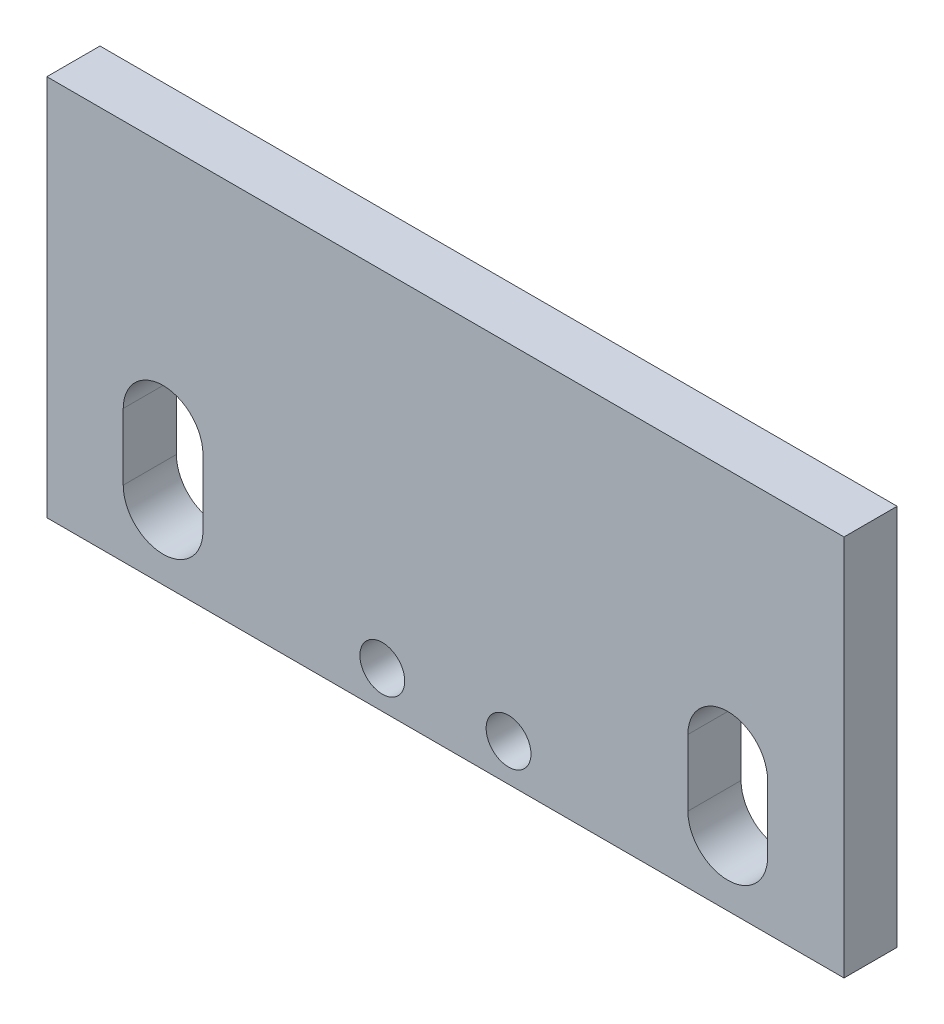
ISO-10303-21;
HEADER;
FILE_DESCRIPTION(('STEP AP214'),'2;1');
FILE_NAME('part.step','',(''),(''),'','','');
FILE_SCHEMA(('AUTOMOTIVE_DESIGN { 1 0 10303 214 1 1 1 1 }'));
ENDSEC;
DATA;
#1=APPLICATION_CONTEXT('core data for automotive mechanical design processes');
#2=APPLICATION_PROTOCOL_DEFINITION('international standard','automotive_design',2000,#1);
#3=PRODUCT_CONTEXT('',#1,'mechanical');
#4=PRODUCT('Part','Part','',(#3));
#5=PRODUCT_RELATED_PRODUCT_CATEGORY('part','',(#4));
#6=PRODUCT_DEFINITION_FORMATION('','',#4);
#7=PRODUCT_DEFINITION_CONTEXT('part definition',#1,'design');
#8=PRODUCT_DEFINITION('design','',#6,#7);
#9=PRODUCT_DEFINITION_SHAPE('','',#8);
#10=(LENGTH_UNIT() NAMED_UNIT(*) SI_UNIT(.MILLI.,.METRE.));
#11=(NAMED_UNIT(*) PLANE_ANGLE_UNIT() SI_UNIT($,.RADIAN.));
#12=(NAMED_UNIT(*) SI_UNIT($,.STERADIAN.) SOLID_ANGLE_UNIT());
#13=UNCERTAINTY_MEASURE_WITH_UNIT(LENGTH_MEASURE(1.E-05),#10,'distance_accuracy_value','');
#14=(GEOMETRIC_REPRESENTATION_CONTEXT(3) GLOBAL_UNCERTAINTY_ASSIGNED_CONTEXT((#13)) GLOBAL_UNIT_ASSIGNED_CONTEXT((#10,
#11,#12)) REPRESENTATION_CONTEXT('',''));
#15=CARTESIAN_POINT('',(0.,0.,0.));
#16=DIRECTION('',(0.,0.,1.));
#17=DIRECTION('',(1.,0.,0.));
#18=AXIS2_PLACEMENT_3D('',#15,#16,#17);
#19=CARTESIAN_POINT('',(0.,0.,1.6));
#20=DIRECTION('',(0.,0.,1.));
#21=DIRECTION('',(1.,0.,0.));
#22=AXIS2_PLACEMENT_3D('',#19,#20,#21);
#23=PLANE('',#22);
#24=CARTESIAN_POINT('',(2.09415464207914,1.15989306813417,1.6));
#25=DIRECTION('',(0.,0.,1.));
#26=DIRECTION('',(1.,0.,0.));
#27=AXIS2_PLACEMENT_3D('',#24,#25,#26);
#28=CIRCLE('',#27,0.674999999999999);
#29=CARTESIAN_POINT('',(2.76915464207914,1.15989306813417,1.6));
#30=VERTEX_POINT('',#29);
#31=EDGE_CURVE('E163',#30,#30,#28,.T.);
#32=ORIENTED_EDGE('',*,*,#31,.F.);
#33=EDGE_LOOP('',(#32));
#34=FACE_BOUND('',#33,.T.);
#35=DIRECTION('',(0.,-1.,0.));
#36=VECTOR('',#35,1.);
#37=CARTESIAN_POINT('',(-8.00584635792085,11.5348920681342,1.6));
#38=LINE('',#37,#36);
#39=CARTESIAN_POINT('',(-8.00584635792085,11.5348920681342,1.6));
#40=VERTEX_POINT('',#39);
#41=CARTESIAN_POINT('',(-8.00584635792085,0.0348920681341701,1.6));
#42=VERTEX_POINT('',#41);
#43=EDGE_CURVE('E222',#40,#42,#38,.T.);
#44=ORIENTED_EDGE('',*,*,#43,.T.);
#45=DIRECTION('',(1.,0.,0.));
#46=VECTOR('',#45,1.);
#47=CARTESIAN_POINT('',(-8.00584635792085,0.0348920681341701,1.6));
#48=LINE('',#47,#46);
#49=CARTESIAN_POINT('',(15.9941026420791,0.0348920681341731,1.6));
#50=VERTEX_POINT('',#49);
#51=EDGE_CURVE('E226',#42,#50,#48,.T.);
#52=ORIENTED_EDGE('',*,*,#51,.T.);
#53=DIRECTION('',(0.,1.,0.));
#54=VECTOR('',#53,1.);
#55=CARTESIAN_POINT('',(15.9941026420791,11.5348920681342,1.6));
#56=LINE('',#55,#54);
#57=CARTESIAN_POINT('',(15.9941026420791,11.5348920681342,1.6));
#58=VERTEX_POINT('',#57);
#59=EDGE_CURVE('E230',#50,#58,#56,.T.);
#60=ORIENTED_EDGE('',*,*,#59,.T.);
#61=DIRECTION('',(-1.,0.,0.));
#62=VECTOR('',#61,1.);
#63=CARTESIAN_POINT('',(-8.00584635792085,11.5348920681342,1.6));
#64=LINE('',#63,#62);
#65=EDGE_CURVE('E233',#58,#40,#64,.T.);
#66=ORIENTED_EDGE('',*,*,#65,.T.);
#67=EDGE_LOOP('',(#44,#52,#60,#66));
#68=FACE_BOUND('',#67,.T.);
#69=DIRECTION('',(0.,1.,0.));
#70=VECTOR('',#69,1.);
#71=CARTESIAN_POINT('',(13.6941026420791,2.03489206813417,1.6));
#72=LINE('',#71,#70);
#73=CARTESIAN_POINT('',(13.6941026420791,2.03489206813417,1.6));
#74=VERTEX_POINT('',#73);
#75=CARTESIAN_POINT('',(13.6941026420791,4.03489206813417,1.6));
#76=VERTEX_POINT('',#75);
#77=EDGE_CURVE('E182',#74,#76,#72,.T.);
#78=ORIENTED_EDGE('',*,*,#77,.F.);
#79=CARTESIAN_POINT('',(12.4941026420791,2.03489206813417,1.6));
#80=DIRECTION('',(0.,0.,1.));
#81=DIRECTION('',(1.,0.,0.));
#82=AXIS2_PLACEMENT_3D('',#79,#80,#81);
#83=CIRCLE('',#82,1.2);
#84=CARTESIAN_POINT('',(11.2941026420791,2.03489206813417,1.6));
#85=VERTEX_POINT('',#84);
#86=EDGE_CURVE('E179',#85,#74,#83,.T.);
#87=ORIENTED_EDGE('',*,*,#86,.F.);
#88=DIRECTION('',(0.,-1.,0.));
#89=VECTOR('',#88,1.);
#90=CARTESIAN_POINT('',(11.2941026420791,2.03489206813417,1.6));
#91=LINE('',#90,#89);
#92=CARTESIAN_POINT('',(11.2941026420791,4.03489206813417,1.6));
#93=VERTEX_POINT('',#92);
#94=EDGE_CURVE('E190',#93,#85,#91,.T.);
#95=ORIENTED_EDGE('',*,*,#94,.F.);
#96=CARTESIAN_POINT('',(12.4941026420791,4.03489206813417,1.6));
#97=DIRECTION('',(0.,0.,1.));
#98=DIRECTION('',(1.,0.,0.));
#99=AXIS2_PLACEMENT_3D('',#96,#97,#98);
#100=CIRCLE('',#99,1.2);
#101=EDGE_CURVE('E186',#76,#93,#100,.T.);
#102=ORIENTED_EDGE('',*,*,#101,.F.);
#103=EDGE_LOOP('',(#78,#87,#95,#102));
#104=FACE_BOUND('',#103,.T.);
#105=DIRECTION('',(0.,1.,0.));
#106=VECTOR('',#105,1.);
#107=CARTESIAN_POINT('',(-3.30584635792085,2.03489206813417,1.6));
#108=LINE('',#107,#106);
#109=CARTESIAN_POINT('',(-3.30584635792085,2.03489206813417,1.6));
#110=VERTEX_POINT('',#109);
#111=CARTESIAN_POINT('',(-3.30584635792086,4.03489206813417,1.6));
#112=VERTEX_POINT('',#111);
#113=EDGE_CURVE('E137',#110,#112,#108,.T.);
#114=ORIENTED_EDGE('',*,*,#113,.F.);
#115=CARTESIAN_POINT('',(-4.50584635792085,2.03489206813417,1.6));
#116=DIRECTION('',(0.,0.,1.));
#117=DIRECTION('',(-1.,0.,0.));
#118=AXIS2_PLACEMENT_3D('',#115,#116,#117);
#119=CIRCLE('',#118,1.2);
#120=CARTESIAN_POINT('',(-5.70584635792085,2.03489206813417,1.6));
#121=VERTEX_POINT('',#120);
#122=EDGE_CURVE('E128',#121,#110,#119,.T.);
#123=ORIENTED_EDGE('',*,*,#122,.F.);
#124=DIRECTION('',(0.,-1.,0.));
#125=VECTOR('',#124,1.);
#126=CARTESIAN_POINT('',(-5.70584635792085,2.03489206813417,1.6));
#127=LINE('',#126,#125);
#128=CARTESIAN_POINT('',(-5.70584635792085,4.03489206813417,1.6));
#129=VERTEX_POINT('',#128);
#130=EDGE_CURVE('E155',#129,#121,#127,.T.);
#131=ORIENTED_EDGE('',*,*,#130,.F.);
#132=CARTESIAN_POINT('',(-4.50584635792085,4.03489206813417,1.6));
#133=DIRECTION('',(0.,0.,1.));
#134=DIRECTION('',(-1.,0.,0.));
#135=AXIS2_PLACEMENT_3D('',#132,#133,#134);
#136=CIRCLE('',#135,1.2);
#137=EDGE_CURVE('E151',#112,#129,#136,.T.);
#138=ORIENTED_EDGE('',*,*,#137,.F.);
#139=EDGE_LOOP('',(#114,#123,#131,#138));
#140=FACE_BOUND('',#139,.T.);
#141=CARTESIAN_POINT('',(5.89415464207915,1.15989306813417,1.6));
#142=DIRECTION('',(0.,0.,1.));
#143=DIRECTION('',(1.,0.,0.));
#144=AXIS2_PLACEMENT_3D('',#141,#142,#143);
#145=CIRCLE('',#144,0.675000000000003);
#146=CARTESIAN_POINT('',(6.56915464207915,1.15989306813417,1.6));
#147=VERTEX_POINT('',#146);
#148=EDGE_CURVE('E350',#147,#147,#145,.T.);
#149=ORIENTED_EDGE('',*,*,#148,.F.);
#150=EDGE_LOOP('',(#149));
#151=FACE_BOUND('',#150,.T.);
#152=ADVANCED_FACE('F38',(#34,#68,#104,#140,#151),#23,.T.);
#153=CARTESIAN_POINT('',(0.,0.,0.));
#154=DIRECTION('',(0.,0.,1.));
#155=DIRECTION('',(1.,0.,0.));
#156=AXIS2_PLACEMENT_3D('',#153,#154,#155);
#157=PLANE('',#156);
#158=CARTESIAN_POINT('',(12.4941026420791,2.03489206813417,0.));
#159=DIRECTION('',(0.,0.,1.));
#160=DIRECTION('',(1.,0.,0.));
#161=AXIS2_PLACEMENT_3D('',#158,#159,#160);
#162=CIRCLE('',#161,1.2);
#163=CARTESIAN_POINT('',(11.2941026420791,2.03489206813417,0.));
#164=VERTEX_POINT('',#163);
#165=CARTESIAN_POINT('',(13.6941026420791,2.03489206813417,0.));
#166=VERTEX_POINT('',#165);
#167=EDGE_CURVE('E146',#164,#166,#162,.T.);
#168=ORIENTED_EDGE('',*,*,#167,.T.);
#169=DIRECTION('',(0.,1.,0.));
#170=VECTOR('',#169,1.);
#171=CARTESIAN_POINT('',(13.6941026420791,2.03489206813417,0.));
#172=LINE('',#171,#170);
#173=CARTESIAN_POINT('',(13.6941026420791,4.03489206813417,0.));
#174=VERTEX_POINT('',#173);
#175=EDGE_CURVE('E197',#166,#174,#172,.T.);
#176=ORIENTED_EDGE('',*,*,#175,.T.);
#177=CARTESIAN_POINT('',(12.4941026420791,4.03489206813417,0.));
#178=DIRECTION('',(0.,0.,1.));
#179=DIRECTION('',(1.,0.,0.));
#180=AXIS2_PLACEMENT_3D('',#177,#178,#179);
#181=CIRCLE('',#180,1.2);
#182=CARTESIAN_POINT('',(11.2941026420791,4.03489206813417,0.));
#183=VERTEX_POINT('',#182);
#184=EDGE_CURVE('E201',#174,#183,#181,.T.);
#185=ORIENTED_EDGE('',*,*,#184,.T.);
#186=DIRECTION('',(0.,-1.,0.));
#187=VECTOR('',#186,1.);
#188=CARTESIAN_POINT('',(11.2941026420791,2.03489206813417,0.));
#189=LINE('',#188,#187);
#190=EDGE_CURVE('E183',#183,#164,#189,.T.);
#191=ORIENTED_EDGE('',*,*,#190,.T.);
#192=EDGE_LOOP('',(#168,#176,#185,#191));
#193=FACE_BOUND('',#192,.T.);
#194=DIRECTION('',(0.,-1.,0.));
#195=VECTOR('',#194,1.);
#196=CARTESIAN_POINT('',(-8.00584635792085,11.5348920681342,0.));
#197=LINE('',#196,#195);
#198=CARTESIAN_POINT('',(-8.00584635792085,11.5348920681342,0.));
#199=VERTEX_POINT('',#198);
#200=CARTESIAN_POINT('',(-8.00584635792085,0.0348920681341701,0.));
#201=VERTEX_POINT('',#200);
#202=EDGE_CURVE('E221',#199,#201,#197,.T.);
#203=ORIENTED_EDGE('',*,*,#202,.F.);
#204=DIRECTION('',(-1.,0.,0.));
#205=VECTOR('',#204,1.);
#206=CARTESIAN_POINT('',(-8.00584635792085,11.5348920681342,0.));
#207=LINE('',#206,#205);
#208=CARTESIAN_POINT('',(15.9941026420791,11.5348920681342,0.));
#209=VERTEX_POINT('',#208);
#210=EDGE_CURVE('E227',#209,#199,#207,.T.);
#211=ORIENTED_EDGE('',*,*,#210,.F.);
#212=DIRECTION('',(0.,1.,0.));
#213=VECTOR('',#212,1.);
#214=CARTESIAN_POINT('',(15.9941026420791,11.5348920681342,0.));
#215=LINE('',#214,#213);
#216=CARTESIAN_POINT('',(15.9941026420791,0.0348920681341731,0.));
#217=VERTEX_POINT('',#216);
#218=EDGE_CURVE('E243',#217,#209,#215,.T.);
#219=ORIENTED_EDGE('',*,*,#218,.F.);
#220=DIRECTION('',(1.,0.,0.));
#221=VECTOR('',#220,1.);
#222=CARTESIAN_POINT('',(-8.00584635792085,0.0348920681341701,0.));
#223=LINE('',#222,#221);
#224=EDGE_CURVE('E240',#201,#217,#223,.T.);
#225=ORIENTED_EDGE('',*,*,#224,.F.);
#226=EDGE_LOOP('',(#203,#211,#219,#225));
#227=FACE_BOUND('',#226,.T.);
#228=CARTESIAN_POINT('',(-4.50584635792085,2.03489206813417,0.));
#229=DIRECTION('',(0.,0.,1.));
#230=DIRECTION('',(-1.,0.,0.));
#231=AXIS2_PLACEMENT_3D('',#228,#229,#230);
#232=CIRCLE('',#231,1.2);
#233=CARTESIAN_POINT('',(-5.70584635792085,2.03489206813417,0.));
#234=VERTEX_POINT('',#233);
#235=CARTESIAN_POINT('',(-3.30584635792085,2.03489206813417,0.));
#236=VERTEX_POINT('',#235);
#237=EDGE_CURVE('E62',#234,#236,#232,.T.);
#238=ORIENTED_EDGE('',*,*,#237,.T.);
#239=DIRECTION('',(0.,1.,0.));
#240=VECTOR('',#239,1.);
#241=CARTESIAN_POINT('',(-3.30584635792085,2.03489206813417,0.));
#242=LINE('',#241,#240);
#243=CARTESIAN_POINT('',(-3.30584635792086,4.03489206813417,0.));
#244=VERTEX_POINT('',#243);
#245=EDGE_CURVE('E144',#236,#244,#242,.T.);
#246=ORIENTED_EDGE('',*,*,#245,.T.);
#247=CARTESIAN_POINT('',(-4.50584635792085,4.03489206813417,0.));
#248=DIRECTION('',(0.,0.,1.));
#249=DIRECTION('',(-1.,0.,0.));
#250=AXIS2_PLACEMENT_3D('',#247,#248,#249);
#251=CIRCLE('',#250,1.2);
#252=CARTESIAN_POINT('',(-5.70584635792085,4.03489206813417,0.));
#253=VERTEX_POINT('',#252);
#254=EDGE_CURVE('E166',#244,#253,#251,.T.);
#255=ORIENTED_EDGE('',*,*,#254,.T.);
#256=DIRECTION('',(0.,-1.,0.));
#257=VECTOR('',#256,1.);
#258=CARTESIAN_POINT('',(-5.70584635792085,2.03489206813417,0.));
#259=LINE('',#258,#257);
#260=EDGE_CURVE('E138',#253,#234,#259,.T.);
#261=ORIENTED_EDGE('',*,*,#260,.T.);
#262=EDGE_LOOP('',(#238,#246,#255,#261));
#263=FACE_BOUND('',#262,.T.);
#264=CARTESIAN_POINT('',(2.09415464207914,1.15989306813417,0.));
#265=DIRECTION('',(0.,0.,1.));
#266=DIRECTION('',(1.,0.,0.));
#267=AXIS2_PLACEMENT_3D('',#264,#265,#266);
#268=CIRCLE('',#267,0.674999999999999);
#269=CARTESIAN_POINT('',(2.76915464207914,1.15989306813417,0.));
#270=VERTEX_POINT('',#269);
#271=EDGE_CURVE('E358',#270,#270,#268,.T.);
#272=ORIENTED_EDGE('',*,*,#271,.T.);
#273=EDGE_LOOP('',(#272));
#274=FACE_BOUND('',#273,.T.);
#275=CARTESIAN_POINT('',(5.89415464207915,1.15989306813417,0.));
#276=DIRECTION('',(0.,0.,1.));
#277=DIRECTION('',(1.,0.,0.));
#278=AXIS2_PLACEMENT_3D('',#275,#276,#277);
#279=CIRCLE('',#278,0.675000000000003);
#280=CARTESIAN_POINT('',(6.56915464207915,1.15989306813417,0.));
#281=VERTEX_POINT('',#280);
#282=EDGE_CURVE('E353',#281,#281,#279,.T.);
#283=ORIENTED_EDGE('',*,*,#282,.T.);
#284=EDGE_LOOP('',(#283));
#285=FACE_BOUND('',#284,.T.);
#286=ADVANCED_FACE('F266',(#193,#227,#263,#274,#285),#157,.F.);
#287=CARTESIAN_POINT('',(-8.00584635792085,11.5348920681342,1.6));
#288=DIRECTION('',(1.,0.,0.));
#289=DIRECTION('',(0.,1.,0.));
#290=AXIS2_PLACEMENT_3D('',#287,#288,#289);
#291=PLANE('',#290);
#292=ORIENTED_EDGE('',*,*,#202,.T.);
#293=DIRECTION('',(0.,0.,-1.));
#294=VECTOR('',#293,1.);
#295=CARTESIAN_POINT('',(-8.00584635792085,0.0348920681341701,1.6));
#296=LINE('',#295,#294);
#297=EDGE_CURVE('E11',#42,#201,#296,.T.);
#298=ORIENTED_EDGE('',*,*,#297,.F.);
#299=ORIENTED_EDGE('',*,*,#43,.F.);
#300=DIRECTION('',(0.,0.,-1.));
#301=VECTOR('',#300,1.);
#302=CARTESIAN_POINT('',(-8.00584635792085,11.5348920681342,1.6));
#303=LINE('',#302,#301);
#304=EDGE_CURVE('E236',#40,#199,#303,.T.);
#305=ORIENTED_EDGE('',*,*,#304,.T.);
#306=EDGE_LOOP('',(#292,#298,#299,#305));
#307=FACE_BOUND('',#306,.T.);
#308=ADVANCED_FACE('F40',(#307),#291,.F.);
#309=CARTESIAN_POINT('',(-8.00584635792085,0.0348920681341701,1.6));
#310=DIRECTION('',(0.,1.,0.));
#311=DIRECTION('',(-1.,0.,0.));
#312=AXIS2_PLACEMENT_3D('',#309,#310,#311);
#313=PLANE('',#312);
#314=ORIENTED_EDGE('',*,*,#224,.T.);
#315=DIRECTION('',(0.,0.,-1.));
#316=VECTOR('',#315,1.);
#317=CARTESIAN_POINT('',(15.9941026420791,0.0348920681341731,1.6));
#318=LINE('',#317,#316);
#319=EDGE_CURVE('E47',#50,#217,#318,.T.);
#320=ORIENTED_EDGE('',*,*,#319,.F.);
#321=ORIENTED_EDGE('',*,*,#51,.F.);
#322=ORIENTED_EDGE('',*,*,#297,.T.);
#323=EDGE_LOOP('',(#314,#320,#321,#322));
#324=FACE_BOUND('',#323,.T.);
#325=ADVANCED_FACE('F277',(#324),#313,.F.);
#326=CARTESIAN_POINT('',(15.9941026420791,11.5348920681342,1.6));
#327=DIRECTION('',(-1.,0.,0.));
#328=DIRECTION('',(0.,-1.,0.));
#329=AXIS2_PLACEMENT_3D('',#326,#327,#328);
#330=PLANE('',#329);
#331=ORIENTED_EDGE('',*,*,#218,.T.);
#332=DIRECTION('',(0.,0.,-1.));
#333=VECTOR('',#332,1.);
#334=CARTESIAN_POINT('',(15.9941026420791,11.5348920681342,1.6));
#335=LINE('',#334,#333);
#336=EDGE_CURVE('E251',#58,#209,#335,.T.);
#337=ORIENTED_EDGE('',*,*,#336,.F.);
#338=ORIENTED_EDGE('',*,*,#59,.F.);
#339=ORIENTED_EDGE('',*,*,#319,.T.);
#340=EDGE_LOOP('',(#331,#337,#338,#339));
#341=FACE_BOUND('',#340,.T.);
#342=ADVANCED_FACE('F260',(#341),#330,.F.);
#343=CARTESIAN_POINT('',(-8.00584635792085,11.5348920681342,1.6));
#344=DIRECTION('',(0.,-1.,0.));
#345=DIRECTION('',(0.,0.,-1.));
#346=AXIS2_PLACEMENT_3D('',#343,#344,#345);
#347=PLANE('',#346);
#348=ORIENTED_EDGE('',*,*,#210,.T.);
#349=ORIENTED_EDGE('',*,*,#304,.F.);
#350=ORIENTED_EDGE('',*,*,#65,.F.);
#351=ORIENTED_EDGE('',*,*,#336,.T.);
#352=EDGE_LOOP('',(#348,#349,#350,#351));
#353=FACE_BOUND('',#352,.T.);
#354=ADVANCED_FACE('F270',(#353),#347,.F.);
#355=CARTESIAN_POINT('',(12.4941026420791,2.03489206813417,1.6));
#356=DIRECTION('',(0.,0.,-1.));
#357=DIRECTION('',(-1.,0.,0.));
#358=AXIS2_PLACEMENT_3D('',#355,#356,#357);
#359=CYLINDRICAL_SURFACE('',#358,1.2);
#360=ORIENTED_EDGE('',*,*,#167,.F.);
#361=DIRECTION('',(0.,0.,-1.));
#362=VECTOR('',#361,1.);
#363=CARTESIAN_POINT('',(11.2941026420791,2.03489206813417,1.6));
#364=LINE('',#363,#362);
#365=EDGE_CURVE('E193',#85,#164,#364,.T.);
#366=ORIENTED_EDGE('',*,*,#365,.F.);
#367=ORIENTED_EDGE('',*,*,#86,.T.);
#368=DIRECTION('',(0.,0.,-1.));
#369=VECTOR('',#368,1.);
#370=CARTESIAN_POINT('',(13.6941026420791,2.03489206813417,1.6));
#371=LINE('',#370,#369);
#372=EDGE_CURVE('E217',#74,#166,#371,.T.);
#373=ORIENTED_EDGE('',*,*,#372,.T.);
#374=EDGE_LOOP('',(#360,#366,#367,#373));
#375=FACE_BOUND('',#374,.T.);
#376=ADVANCED_FACE('F294',(#375),#359,.F.);
#377=CARTESIAN_POINT('',(13.6941026420791,2.03489206813417,1.6));
#378=DIRECTION('',(-1.,0.,0.));
#379=DIRECTION('',(0.,0.,1.));
#380=AXIS2_PLACEMENT_3D('',#377,#378,#379);
#381=PLANE('',#380);
#382=ORIENTED_EDGE('',*,*,#175,.F.);
#383=ORIENTED_EDGE('',*,*,#372,.F.);
#384=ORIENTED_EDGE('',*,*,#77,.T.);
#385=DIRECTION('',(0.,0.,-1.));
#386=VECTOR('',#385,1.);
#387=CARTESIAN_POINT('',(13.6941026420791,4.03489206813417,1.6));
#388=LINE('',#387,#386);
#389=EDGE_CURVE('E214',#76,#174,#388,.T.);
#390=ORIENTED_EDGE('',*,*,#389,.T.);
#391=EDGE_LOOP('',(#382,#383,#384,#390));
#392=FACE_BOUND('',#391,.T.);
#393=ADVANCED_FACE('F301',(#392),#381,.T.);
#394=CARTESIAN_POINT('',(12.4941026420791,4.03489206813417,1.6));
#395=DIRECTION('',(0.,0.,-1.));
#396=DIRECTION('',(-1.,0.,0.));
#397=AXIS2_PLACEMENT_3D('',#394,#395,#396);
#398=CYLINDRICAL_SURFACE('',#397,1.2);
#399=ORIENTED_EDGE('',*,*,#184,.F.);
#400=ORIENTED_EDGE('',*,*,#389,.F.);
#401=ORIENTED_EDGE('',*,*,#101,.T.);
#402=DIRECTION('',(0.,0.,-1.));
#403=VECTOR('',#402,1.);
#404=CARTESIAN_POINT('',(11.2941026420791,4.03489206813417,1.6));
#405=LINE('',#404,#403);
#406=EDGE_CURVE('E211',#93,#183,#405,.T.);
#407=ORIENTED_EDGE('',*,*,#406,.T.);
#408=EDGE_LOOP('',(#399,#400,#401,#407));
#409=FACE_BOUND('',#408,.T.);
#410=ADVANCED_FACE('F306',(#409),#398,.F.);
#411=CARTESIAN_POINT('',(11.2941026420791,2.03489206813417,1.6));
#412=DIRECTION('',(1.,0.,0.));
#413=DIRECTION('',(0.,1.,0.));
#414=AXIS2_PLACEMENT_3D('',#411,#412,#413);
#415=PLANE('',#414);
#416=ORIENTED_EDGE('',*,*,#190,.F.);
#417=ORIENTED_EDGE('',*,*,#406,.F.);
#418=ORIENTED_EDGE('',*,*,#94,.T.);
#419=ORIENTED_EDGE('',*,*,#365,.T.);
#420=EDGE_LOOP('',(#416,#417,#418,#419));
#421=FACE_BOUND('',#420,.T.);
#422=ADVANCED_FACE('F313',(#421),#415,.T.);
#423=CARTESIAN_POINT('',(-4.50584635792085,2.03489206813417,1.6));
#424=DIRECTION('',(0.,0.,-1.));
#425=DIRECTION('',(-1.,0.,0.));
#426=AXIS2_PLACEMENT_3D('',#423,#424,#425);
#427=CYLINDRICAL_SURFACE('',#426,1.2);
#428=ORIENTED_EDGE('',*,*,#237,.F.);
#429=DIRECTION('',(0.,0.,-1.));
#430=VECTOR('',#429,1.);
#431=CARTESIAN_POINT('',(-5.70584635792085,2.03489206813417,1.6));
#432=LINE('',#431,#430);
#433=EDGE_CURVE('E132',#121,#234,#432,.T.);
#434=ORIENTED_EDGE('',*,*,#433,.F.);
#435=ORIENTED_EDGE('',*,*,#122,.T.);
#436=DIRECTION('',(0.,0.,-1.));
#437=VECTOR('',#436,1.);
#438=CARTESIAN_POINT('',(-3.30584635792085,2.03489206813417,1.6));
#439=LINE('',#438,#437);
#440=EDGE_CURVE('E131',#110,#236,#439,.T.);
#441=ORIENTED_EDGE('',*,*,#440,.T.);
#442=EDGE_LOOP('',(#428,#434,#435,#441));
#443=FACE_BOUND('',#442,.T.);
#444=ADVANCED_FACE('F130',(#443),#427,.F.);
#445=CARTESIAN_POINT('',(-3.30584635792085,2.03489206813417,1.6));
#446=DIRECTION('',(-1.,0.,0.));
#447=DIRECTION('',(0.,-1.,0.));
#448=AXIS2_PLACEMENT_3D('',#445,#446,#447);
#449=PLANE('',#448);
#450=ORIENTED_EDGE('',*,*,#245,.F.);
#451=ORIENTED_EDGE('',*,*,#440,.F.);
#452=ORIENTED_EDGE('',*,*,#113,.T.);
#453=DIRECTION('',(0.,0.,-1.));
#454=VECTOR('',#453,1.);
#455=CARTESIAN_POINT('',(-3.30584635792086,4.03489206813417,1.6));
#456=LINE('',#455,#454);
#457=EDGE_CURVE('E147',#112,#244,#456,.T.);
#458=ORIENTED_EDGE('',*,*,#457,.T.);
#459=EDGE_LOOP('',(#450,#451,#452,#458));
#460=FACE_BOUND('',#459,.T.);
#461=ADVANCED_FACE('F141',(#460),#449,.T.);
#462=CARTESIAN_POINT('',(-4.50584635792085,4.03489206813417,1.6));
#463=DIRECTION('',(0.,0.,-1.));
#464=DIRECTION('',(-1.,0.,0.));
#465=AXIS2_PLACEMENT_3D('',#462,#463,#464);
#466=CYLINDRICAL_SURFACE('',#465,1.2);
#467=ORIENTED_EDGE('',*,*,#254,.F.);
#468=ORIENTED_EDGE('',*,*,#457,.F.);
#469=ORIENTED_EDGE('',*,*,#137,.T.);
#470=DIRECTION('',(0.,0.,-1.));
#471=VECTOR('',#470,1.);
#472=CARTESIAN_POINT('',(-5.70584635792085,4.03489206813417,1.6));
#473=LINE('',#472,#471);
#474=EDGE_CURVE('E54',#129,#253,#473,.T.);
#475=ORIENTED_EDGE('',*,*,#474,.T.);
#476=EDGE_LOOP('',(#467,#468,#469,#475));
#477=FACE_BOUND('',#476,.T.);
#478=ADVANCED_FACE('F331',(#477),#466,.F.);
#479=CARTESIAN_POINT('',(-5.70584635792085,2.03489206813417,1.6));
#480=DIRECTION('',(1.,0.,0.));
#481=DIRECTION('',(0.,0.,-1.));
#482=AXIS2_PLACEMENT_3D('',#479,#480,#481);
#483=PLANE('',#482);
#484=ORIENTED_EDGE('',*,*,#260,.F.);
#485=ORIENTED_EDGE('',*,*,#474,.F.);
#486=ORIENTED_EDGE('',*,*,#130,.T.);
#487=ORIENTED_EDGE('',*,*,#433,.T.);
#488=EDGE_LOOP('',(#484,#485,#486,#487));
#489=FACE_BOUND('',#488,.T.);
#490=ADVANCED_FACE('F334',(#489),#483,.T.);
#491=CARTESIAN_POINT('',(2.09415464207914,1.15989306813417,1.6));
#492=DIRECTION('',(0.,0.,-1.));
#493=DIRECTION('',(-1.,0.,0.));
#494=AXIS2_PLACEMENT_3D('',#491,#492,#493);
#495=CYLINDRICAL_SURFACE('',#494,0.674999999999999);
#496=ORIENTED_EDGE('',*,*,#31,.T.);
#497=EDGE_LOOP('',(#496));
#498=FACE_BOUND('',#497,.T.);
#499=ORIENTED_EDGE('',*,*,#271,.F.);
#500=EDGE_LOOP('',(#499));
#501=FACE_BOUND('',#500,.T.);
#502=ADVANCED_FACE('F338',(#498,#501),#495,.F.);
#503=CARTESIAN_POINT('',(5.89415464207915,1.15989306813417,1.6));
#504=DIRECTION('',(0.,0.,-1.));
#505=DIRECTION('',(-1.,0.,0.));
#506=AXIS2_PLACEMENT_3D('',#503,#504,#505);
#507=CYLINDRICAL_SURFACE('',#506,0.675000000000003);
#508=ORIENTED_EDGE('',*,*,#148,.T.);
#509=EDGE_LOOP('',(#508));
#510=FACE_BOUND('',#509,.T.);
#511=ORIENTED_EDGE('',*,*,#282,.F.);
#512=EDGE_LOOP('',(#511));
#513=FACE_BOUND('',#512,.T.);
#514=ADVANCED_FACE('F341',(#510,#513),#507,.F.);
#515=CLOSED_SHELL('',(#152,#286,#308,#325,#342,#354,#376,#393,#410,#422,#444,#461,#478,#490,
#502,#514));
#516=MANIFOLD_SOLID_BREP('B2',#515);
#517=ADVANCED_BREP_SHAPE_REPRESENTATION('',(#18,#516),#14);
#518=SHAPE_DEFINITION_REPRESENTATION(#9,#517);
ENDSEC;
END-ISO-10303-21;
